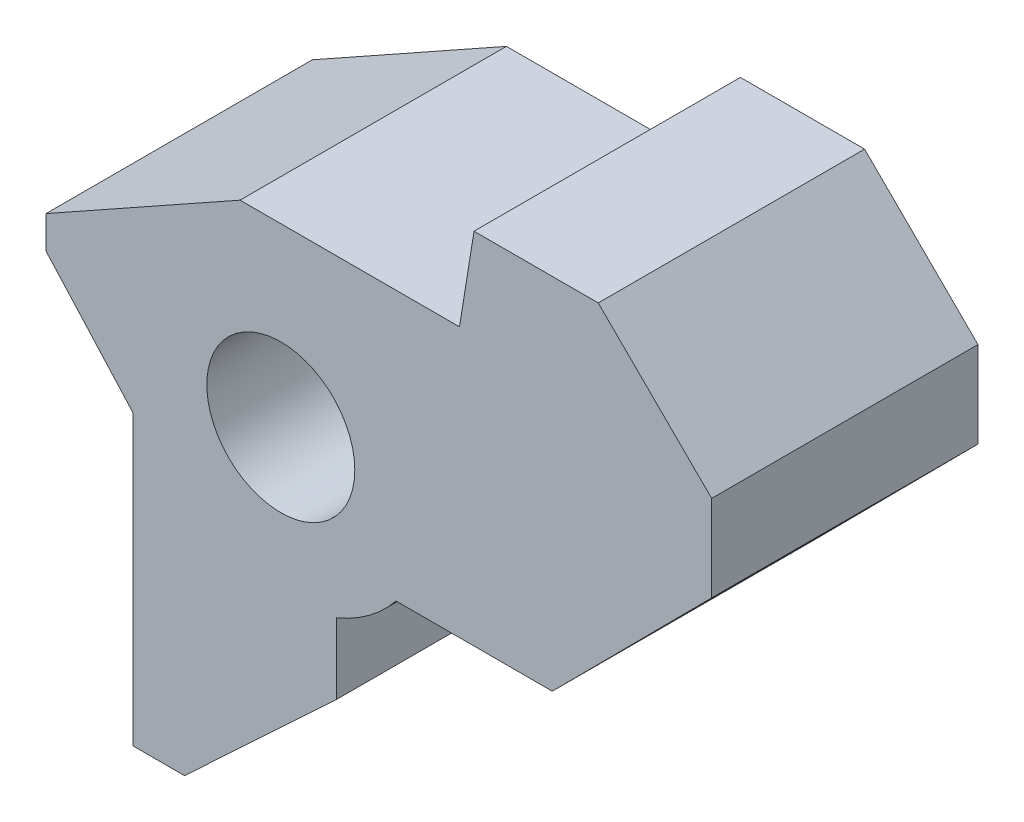
ISO-10303-21;
HEADER;
FILE_DESCRIPTION(('STEP AP214'),'2;1');
FILE_NAME('part.step','',(''),(''),'','','');
FILE_SCHEMA(('AUTOMOTIVE_DESIGN { 1 0 10303 214 1 1 1 1 }'));
ENDSEC;
DATA;
#1=APPLICATION_CONTEXT('core data for automotive mechanical design processes');
#2=APPLICATION_PROTOCOL_DEFINITION('international standard','automotive_design',2000,#1);
#3=PRODUCT_CONTEXT('',#1,'mechanical');
#4=PRODUCT('Part','Part','',(#3));
#5=PRODUCT_RELATED_PRODUCT_CATEGORY('part','',(#4));
#6=PRODUCT_DEFINITION_FORMATION('','',#4);
#7=PRODUCT_DEFINITION_CONTEXT('part definition',#1,'design');
#8=PRODUCT_DEFINITION('design','',#6,#7);
#9=PRODUCT_DEFINITION_SHAPE('','',#8);
#10=(LENGTH_UNIT() NAMED_UNIT(*) SI_UNIT(.MILLI.,.METRE.));
#11=(NAMED_UNIT(*) PLANE_ANGLE_UNIT() SI_UNIT($,.RADIAN.));
#12=(NAMED_UNIT(*) SI_UNIT($,.STERADIAN.) SOLID_ANGLE_UNIT());
#13=UNCERTAINTY_MEASURE_WITH_UNIT(LENGTH_MEASURE(1.E-05),#10,'distance_accuracy_value','');
#14=(GEOMETRIC_REPRESENTATION_CONTEXT(3) GLOBAL_UNCERTAINTY_ASSIGNED_CONTEXT((#13)) GLOBAL_UNIT_ASSIGNED_CONTEXT((#10,
#11,#12)) REPRESENTATION_CONTEXT('',''));
#15=CARTESIAN_POINT('',(0.,0.,0.));
#16=DIRECTION('',(0.,0.,1.));
#17=DIRECTION('',(1.,0.,0.));
#18=AXIS2_PLACEMENT_3D('',#15,#16,#17);
#19=CARTESIAN_POINT('',(1.87605445969652,0.,9.));
#20=DIRECTION('',(1.,0.,0.));
#21=DIRECTION('',(0.,0.,-1.));
#22=AXIS2_PLACEMENT_3D('',#19,#20,#21);
#23=PLANE('',#22);
#24=DIRECTION('',(0.,-1.,0.));
#25=VECTOR('',#24,1.);
#26=CARTESIAN_POINT('',(1.87605445969652,0.,0.));
#27=LINE('',#26,#25);
#28=CARTESIAN_POINT('',(1.87605445969652,-4.63469736490451,0.));
#29=VERTEX_POINT('',#28);
#30=CARTESIAN_POINT('',(1.87605445969652,-7.03141405348529,0.));
#31=VERTEX_POINT('',#30);
#32=EDGE_CURVE('E174',#29,#31,#27,.T.);
#33=ORIENTED_EDGE('',*,*,#32,.F.);
#34=DIRECTION('',(0.,0.,-1.));
#35=VECTOR('',#34,1.);
#36=CARTESIAN_POINT('',(1.87605445969652,-4.63469736490451,9.));
#37=LINE('',#36,#35);
#38=CARTESIAN_POINT('',(1.87605445969652,-4.63469736490451,9.));
#39=VERTEX_POINT('',#38);
#40=EDGE_CURVE('E11',#39,#29,#37,.T.);
#41=ORIENTED_EDGE('',*,*,#40,.F.);
#42=DIRECTION('',(0.,-1.,0.));
#43=VECTOR('',#42,1.);
#44=CARTESIAN_POINT('',(1.87605445969652,0.,9.));
#45=LINE('',#44,#43);
#46=CARTESIAN_POINT('',(1.87605445969652,-7.03141405348529,9.));
#47=VERTEX_POINT('',#46);
#48=EDGE_CURVE('E218',#39,#47,#45,.T.);
#49=ORIENTED_EDGE('',*,*,#48,.T.);
#50=DIRECTION('',(0.,0.,-1.));
#51=VECTOR('',#50,1.);
#52=CARTESIAN_POINT('',(1.87605445969652,-7.03141405348529,9.));
#53=LINE('',#52,#51);
#54=EDGE_CURVE('E105',#47,#31,#53,.T.);
#55=ORIENTED_EDGE('',*,*,#54,.T.);
#56=EDGE_LOOP('',(#33,#41,#49,#55));
#57=FACE_BOUND('',#56,.T.);
#58=ADVANCED_FACE('F34',(#57),#23,.T.);
#59=CARTESIAN_POINT('',(0.,0.,9.));
#60=DIRECTION('',(0.,0.,-1.));
#61=DIRECTION('',(-1.,0.,0.));
#62=AXIS2_PLACEMENT_3D('',#59,#60,#61);
#63=CYLINDRICAL_SURFACE('',#62,5.);
#64=CARTESIAN_POINT('',(0.,0.,0.));
#65=DIRECTION('',(0.,0.,1.));
#66=DIRECTION('',(1.,0.,0.));
#67=AXIS2_PLACEMENT_3D('',#64,#65,#66);
#68=CIRCLE('',#67,5.);
#69=CARTESIAN_POINT('',(3.8931956076666,-3.13736003041498,0.));
#70=VERTEX_POINT('',#69);
#71=EDGE_CURVE('E177',#29,#70,#68,.T.);
#72=ORIENTED_EDGE('',*,*,#71,.T.);
#73=DIRECTION('',(0.,0.,-1.));
#74=VECTOR('',#73,1.);
#75=CARTESIAN_POINT('',(3.8931956076666,-3.13736003041498,9.));
#76=LINE('',#75,#74);
#77=CARTESIAN_POINT('',(3.8931956076666,-3.13736003041498,9.));
#78=VERTEX_POINT('',#77);
#79=EDGE_CURVE('E42',#78,#70,#76,.T.);
#80=ORIENTED_EDGE('',*,*,#79,.F.);
#81=CARTESIAN_POINT('',(0.,0.,9.));
#82=DIRECTION('',(0.,0.,1.));
#83=DIRECTION('',(1.,0.,0.));
#84=AXIS2_PLACEMENT_3D('',#81,#82,#83);
#85=CIRCLE('',#84,5.);
#86=EDGE_CURVE('E261',#39,#78,#85,.T.);
#87=ORIENTED_EDGE('',*,*,#86,.F.);
#88=ORIENTED_EDGE('',*,*,#40,.T.);
#89=EDGE_LOOP('',(#72,#80,#87,#88));
#90=FACE_BOUND('',#89,.T.);
#91=ADVANCED_FACE('F248',(#90),#63,.T.);
#92=CARTESIAN_POINT('',(0.,-3.13736003041498,9.));
#93=DIRECTION('',(0.,-1.,0.));
#94=DIRECTION('',(1.,0.,0.));
#95=AXIS2_PLACEMENT_3D('',#92,#93,#94);
#96=PLANE('',#95);
#97=DIRECTION('',(-1.,0.,0.));
#98=VECTOR('',#97,1.);
#99=CARTESIAN_POINT('',(0.,-3.13736003041498,0.));
#100=LINE('',#99,#98);
#101=CARTESIAN_POINT('',(9.17297865889068,-3.13736003041498,0.));
#102=VERTEX_POINT('',#101);
#103=EDGE_CURVE('E180',#102,#70,#100,.T.);
#104=ORIENTED_EDGE('',*,*,#103,.F.);
#105=DIRECTION('',(0.,0.,-1.));
#106=VECTOR('',#105,1.);
#107=CARTESIAN_POINT('',(9.17297865889068,-3.13736003041498,9.));
#108=LINE('',#107,#106);
#109=CARTESIAN_POINT('',(9.17297865889068,-3.13736003041498,9.));
#110=VERTEX_POINT('',#109);
#111=EDGE_CURVE('E238',#110,#102,#108,.T.);
#112=ORIENTED_EDGE('',*,*,#111,.F.);
#113=DIRECTION('',(-1.,0.,0.));
#114=VECTOR('',#113,1.);
#115=CARTESIAN_POINT('',(0.,-3.13736003041498,9.));
#116=LINE('',#115,#114);
#117=EDGE_CURVE('E245',#110,#78,#116,.T.);
#118=ORIENTED_EDGE('',*,*,#117,.T.);
#119=ORIENTED_EDGE('',*,*,#79,.T.);
#120=EDGE_LOOP('',(#104,#112,#118,#119));
#121=FACE_BOUND('',#120,.T.);
#122=ADVANCED_FACE('F243',(#121),#96,.T.);
#123=CARTESIAN_POINT('',(6.18871742745594,-6.14355777107952,9.));
#124=DIRECTION('',(0.709691382805682,-0.704512697665102,0.));
#125=DIRECTION('',(0.704512697665102,0.709691382805682,0.));
#126=AXIS2_PLACEMENT_3D('',#123,#124,#125);
#127=PLANE('',#126);
#128=DIRECTION('',(-0.704512697665102,-0.709691382805682,0.));
#129=VECTOR('',#128,1.);
#130=CARTESIAN_POINT('',(6.18871742745594,-6.14355777107952,0.));
#131=LINE('',#130,#129);
#132=CARTESIAN_POINT('',(14.557074242056,2.28631260492328,0.));
#133=VERTEX_POINT('',#132);
#134=EDGE_CURVE('E183',#133,#102,#131,.T.);
#135=ORIENTED_EDGE('',*,*,#134,.F.);
#136=DIRECTION('',(0.,0.,-1.));
#137=VECTOR('',#136,1.);
#138=CARTESIAN_POINT('',(14.557074242056,2.28631260492328,9.));
#139=LINE('',#138,#137);
#140=CARTESIAN_POINT('',(14.557074242056,2.28631260492328,9.));
#141=VERTEX_POINT('',#140);
#142=EDGE_CURVE('E236',#141,#133,#139,.T.);
#143=ORIENTED_EDGE('',*,*,#142,.F.);
#144=DIRECTION('',(-0.704512697665102,-0.709691382805682,0.));
#145=VECTOR('',#144,1.);
#146=CARTESIAN_POINT('',(6.18871742745594,-6.14355777107952,9.));
#147=LINE('',#146,#145);
#148=EDGE_CURVE('E258',#141,#110,#147,.T.);
#149=ORIENTED_EDGE('',*,*,#148,.T.);
#150=ORIENTED_EDGE('',*,*,#111,.T.);
#151=EDGE_LOOP('',(#135,#143,#149,#150));
#152=FACE_BOUND('',#151,.T.);
#153=ADVANCED_FACE('F255',(#152),#127,.T.);
#154=CARTESIAN_POINT('',(14.557074242056,0.,9.));
#155=DIRECTION('',(1.,0.,0.));
#156=DIRECTION('',(0.,0.,-1.));
#157=AXIS2_PLACEMENT_3D('',#154,#155,#156);
#158=PLANE('',#157);
#159=DIRECTION('',(0.,-1.,0.));
#160=VECTOR('',#159,1.);
#161=CARTESIAN_POINT('',(14.557074242056,0.,0.));
#162=LINE('',#161,#160);
#163=CARTESIAN_POINT('',(14.557074242056,5.19802237614641,0.));
#164=VERTEX_POINT('',#163);
#165=EDGE_CURVE('E186',#164,#133,#162,.T.);
#166=ORIENTED_EDGE('',*,*,#165,.F.);
#167=DIRECTION('',(0.,0.,-1.));
#168=VECTOR('',#167,1.);
#169=CARTESIAN_POINT('',(14.557074242056,5.19802237614641,9.));
#170=LINE('',#169,#168);
#171=CARTESIAN_POINT('',(14.557074242056,5.19802237614641,9.));
#172=VERTEX_POINT('',#171);
#173=EDGE_CURVE('E234',#172,#164,#170,.T.);
#174=ORIENTED_EDGE('',*,*,#173,.F.);
#175=DIRECTION('',(0.,-1.,0.));
#176=VECTOR('',#175,1.);
#177=CARTESIAN_POINT('',(14.557074242056,0.,9.));
#178=LINE('',#177,#176);
#179=EDGE_CURVE('E263',#172,#141,#178,.T.);
#180=ORIENTED_EDGE('',*,*,#179,.T.);
#181=ORIENTED_EDGE('',*,*,#142,.T.);
#182=EDGE_LOOP('',(#166,#174,#180,#181));
#183=FACE_BOUND('',#182,.T.);
#184=ADVANCED_FACE('F301',(#183),#158,.T.);
#185=CARTESIAN_POINT('',(9.82417265596004,9.89638753174656,9.));
#186=DIRECTION('',(0.704512697665102,0.709691382805682,0.));
#187=DIRECTION('',(-0.709691382805682,0.704512697665102,0.));
#188=AXIS2_PLACEMENT_3D('',#185,#186,#187);
#189=PLANE('',#188);
#190=DIRECTION('',(0.709691382805682,-0.704512697665102,0.));
#191=VECTOR('',#190,1.);
#192=CARTESIAN_POINT('',(9.82417265596004,9.89638753174656,0.));
#193=LINE('',#192,#191);
#194=CARTESIAN_POINT('',(10.7256498043451,9.00148854737192,0.));
#195=VERTEX_POINT('',#194);
#196=EDGE_CURVE('E189',#195,#164,#193,.T.);
#197=ORIENTED_EDGE('',*,*,#196,.F.);
#198=DIRECTION('',(0.,0.,-1.));
#199=VECTOR('',#198,1.);
#200=CARTESIAN_POINT('',(10.7256498043451,9.00148854737192,9.));
#201=LINE('',#200,#199);
#202=CARTESIAN_POINT('',(10.7256498043451,9.00148854737192,9.));
#203=VERTEX_POINT('',#202);
#204=EDGE_CURVE('E232',#203,#195,#201,.T.);
#205=ORIENTED_EDGE('',*,*,#204,.F.);
#206=DIRECTION('',(0.709691382805682,-0.704512697665102,0.));
#207=VECTOR('',#206,1.);
#208=CARTESIAN_POINT('',(9.82417265596004,9.89638753174656,9.));
#209=LINE('',#208,#207);
#210=EDGE_CURVE('E269',#203,#172,#209,.T.);
#211=ORIENTED_EDGE('',*,*,#210,.T.);
#212=ORIENTED_EDGE('',*,*,#173,.T.);
#213=EDGE_LOOP('',(#197,#205,#211,#212));
#214=FACE_BOUND('',#213,.T.);
#215=ADVANCED_FACE('F304',(#214),#189,.T.);
#216=CARTESIAN_POINT('',(0.,9.00148854737192,9.));
#217=DIRECTION('',(0.,1.,0.));
#218=DIRECTION('',(0.,0.,1.));
#219=AXIS2_PLACEMENT_3D('',#216,#217,#218);
#220=PLANE('',#219);
#221=DIRECTION('',(1.,0.,0.));
#222=VECTOR('',#221,1.);
#223=CARTESIAN_POINT('',(0.,9.00148854737192,0.));
#224=LINE('',#223,#222);
#225=CARTESIAN_POINT('',(6.5285930170798,9.00148854737192,0.));
#226=VERTEX_POINT('',#225);
#227=EDGE_CURVE('E192',#226,#195,#224,.T.);
#228=ORIENTED_EDGE('',*,*,#227,.F.);
#229=DIRECTION('',(0.,0.,-1.));
#230=VECTOR('',#229,1.);
#231=CARTESIAN_POINT('',(6.5285930170798,9.00148854737192,9.));
#232=LINE('',#231,#230);
#233=CARTESIAN_POINT('',(6.5285930170798,9.00148854737192,9.));
#234=VERTEX_POINT('',#233);
#235=EDGE_CURVE('E230',#234,#226,#232,.T.);
#236=ORIENTED_EDGE('',*,*,#235,.F.);
#237=DIRECTION('',(1.,0.,0.));
#238=VECTOR('',#237,1.);
#239=CARTESIAN_POINT('',(0.,9.00148854737192,9.));
#240=LINE('',#239,#238);
#241=EDGE_CURVE('E272',#234,#203,#240,.T.);
#242=ORIENTED_EDGE('',*,*,#241,.T.);
#243=ORIENTED_EDGE('',*,*,#204,.T.);
#244=EDGE_LOOP('',(#228,#236,#242,#243));
#245=FACE_BOUND('',#244,.T.);
#246=ADVANCED_FACE('F308',(#245),#220,.T.);
#247=CARTESIAN_POINT('',(4.94893615583577,-0.797776271857066,9.));
#248=DIRECTION('',(-0.987254891374429,0.159147037224273,0.));
#249=DIRECTION('',(-0.159147037224273,-0.987254891374429,0.));
#250=AXIS2_PLACEMENT_3D('',#247,#248,#249);
#251=PLANE('',#250);
#252=DIRECTION('',(0.159147037224273,0.987254891374429,0.));
#253=VECTOR('',#252,1.);
#254=CARTESIAN_POINT('',(4.94893615583577,-0.797776271857066,0.));
#255=LINE('',#254,#253);
#256=CARTESIAN_POINT('',(6.03788217845628,5.95740626892641,0.));
#257=VERTEX_POINT('',#256);
#258=EDGE_CURVE('E195',#257,#226,#255,.T.);
#259=ORIENTED_EDGE('',*,*,#258,.F.);
#260=DIRECTION('',(0.,0.,-1.));
#261=VECTOR('',#260,1.);
#262=CARTESIAN_POINT('',(6.03788217845628,5.95740626892641,9.));
#263=LINE('',#262,#261);
#264=CARTESIAN_POINT('',(6.03788217845628,5.95740626892641,9.));
#265=VERTEX_POINT('',#264);
#266=EDGE_CURVE('E228',#265,#257,#263,.T.);
#267=ORIENTED_EDGE('',*,*,#266,.F.);
#268=DIRECTION('',(0.159147037224273,0.987254891374429,0.));
#269=VECTOR('',#268,1.);
#270=CARTESIAN_POINT('',(4.94893615583577,-0.797776271857066,9.));
#271=LINE('',#270,#269);
#272=EDGE_CURVE('E275',#265,#234,#271,.T.);
#273=ORIENTED_EDGE('',*,*,#272,.T.);
#274=ORIENTED_EDGE('',*,*,#235,.T.);
#275=EDGE_LOOP('',(#259,#267,#273,#274));
#276=FACE_BOUND('',#275,.T.);
#277=ADVANCED_FACE('F312',(#276),#251,.T.);
#278=CARTESIAN_POINT('',(0.,5.95740626892641,9.));
#279=DIRECTION('',(0.,-1.,0.));
#280=DIRECTION('',(1.,0.,0.));
#281=AXIS2_PLACEMENT_3D('',#278,#279,#280);
#282=PLANE('',#281);
#283=DIRECTION('',(-1.,0.,0.));
#284=VECTOR('',#283,1.);
#285=CARTESIAN_POINT('',(0.,5.95740626892641,0.));
#286=LINE('',#285,#284);
#287=CARTESIAN_POINT('',(-1.37635566788677,5.95740626892641,0.));
#288=VERTEX_POINT('',#287);
#289=EDGE_CURVE('E198',#257,#288,#286,.T.);
#290=ORIENTED_EDGE('',*,*,#289,.T.);
#291=DIRECTION('',(0.,0.,-1.));
#292=VECTOR('',#291,1.);
#293=CARTESIAN_POINT('',(-1.37635566788677,5.95740626892641,9.));
#294=LINE('',#293,#292);
#295=CARTESIAN_POINT('',(-1.37635566788677,5.95740626892641,9.));
#296=VERTEX_POINT('',#295);
#297=EDGE_CURVE('E226',#296,#288,#294,.T.);
#298=ORIENTED_EDGE('',*,*,#297,.F.);
#299=DIRECTION('',(-1.,0.,0.));
#300=VECTOR('',#299,1.);
#301=CARTESIAN_POINT('',(0.,5.95740626892641,9.));
#302=LINE('',#301,#300);
#303=EDGE_CURVE('E278',#265,#296,#302,.T.);
#304=ORIENTED_EDGE('',*,*,#303,.F.);
#305=ORIENTED_EDGE('',*,*,#266,.T.);
#306=EDGE_LOOP('',(#290,#298,#304,#305));
#307=FACE_BOUND('',#306,.T.);
#308=ADVANCED_FACE('F316',(#307),#282,.F.);
#309=CARTESIAN_POINT('',(-2.8678772487103,5.12233826098467,9.));
#310=DIRECTION('',(-0.488521388480713,0.872551919943379,0.));
#311=DIRECTION('',(-0.872551919943379,-0.488521388480713,0.));
#312=AXIS2_PLACEMENT_3D('',#309,#310,#311);
#313=PLANE('',#312);
#314=DIRECTION('',(0.872551919943379,0.488521388480713,0.));
#315=VECTOR('',#314,1.);
#316=CARTESIAN_POINT('',(-2.8678772487103,5.12233826098467,0.));
#317=LINE('',#316,#315);
#318=CARTESIAN_POINT('',(-7.93332512787259,2.28631260492328,0.));
#319=VERTEX_POINT('',#318);
#320=EDGE_CURVE('E201',#319,#288,#317,.T.);
#321=ORIENTED_EDGE('',*,*,#320,.F.);
#322=DIRECTION('',(0.,0.,-1.));
#323=VECTOR('',#322,1.);
#324=CARTESIAN_POINT('',(-7.93332512787259,2.28631260492328,9.));
#325=LINE('',#324,#323);
#326=CARTESIAN_POINT('',(-7.93332512787259,2.28631260492328,9.));
#327=VERTEX_POINT('',#326);
#328=EDGE_CURVE('E224',#327,#319,#325,.T.);
#329=ORIENTED_EDGE('',*,*,#328,.F.);
#330=DIRECTION('',(0.872551919943379,0.488521388480713,0.));
#331=VECTOR('',#330,1.);
#332=CARTESIAN_POINT('',(-2.8678772487103,5.12233826098467,9.));
#333=LINE('',#332,#331);
#334=EDGE_CURVE('E280',#327,#296,#333,.T.);
#335=ORIENTED_EDGE('',*,*,#334,.T.);
#336=ORIENTED_EDGE('',*,*,#297,.T.);
#337=EDGE_LOOP('',(#321,#329,#335,#336));
#338=FACE_BOUND('',#337,.T.);
#339=ADVANCED_FACE('F320',(#338),#313,.T.);
#340=CARTESIAN_POINT('',(-7.93332512787259,0.,9.));
#341=DIRECTION('',(-1.,0.,0.));
#342=DIRECTION('',(0.,0.,1.));
#343=AXIS2_PLACEMENT_3D('',#340,#341,#342);
#344=PLANE('',#343);
#345=DIRECTION('',(0.,1.,0.));
#346=VECTOR('',#345,1.);
#347=CARTESIAN_POINT('',(-7.93332512787259,0.,0.));
#348=LINE('',#347,#346);
#349=CARTESIAN_POINT('',(-7.93332512787259,1.18824290486244,0.));
#350=VERTEX_POINT('',#349);
#351=EDGE_CURVE('E204',#350,#319,#348,.T.);
#352=ORIENTED_EDGE('',*,*,#351,.F.);
#353=DIRECTION('',(0.,0.,-1.));
#354=VECTOR('',#353,1.);
#355=CARTESIAN_POINT('',(-7.93332512787259,1.18824290486244,9.));
#356=LINE('',#355,#354);
#357=CARTESIAN_POINT('',(-7.93332512787259,1.18824290486244,9.));
#358=VERTEX_POINT('',#357);
#359=EDGE_CURVE('E222',#358,#350,#356,.T.);
#360=ORIENTED_EDGE('',*,*,#359,.F.);
#361=DIRECTION('',(0.,1.,0.));
#362=VECTOR('',#361,1.);
#363=CARTESIAN_POINT('',(-7.93332512787259,0.,9.));
#364=LINE('',#363,#362);
#365=EDGE_CURVE('E283',#358,#327,#364,.T.);
#366=ORIENTED_EDGE('',*,*,#365,.T.);
#367=ORIENTED_EDGE('',*,*,#328,.T.);
#368=EDGE_LOOP('',(#352,#360,#366,#367));
#369=FACE_BOUND('',#368,.T.);
#370=ADVANCED_FACE('F324',(#369),#344,.T.);
#371=CARTESIAN_POINT('',(-3.78659119415008,-3.41274346894509,9.));
#372=DIRECTION('',(-0.742824639331619,-0.66948603809329,0.));
#373=DIRECTION('',(0.66948603809329,-0.742824639331619,0.));
#374=AXIS2_PLACEMENT_3D('',#371,#372,#373);
#375=PLANE('',#374);
#376=DIRECTION('',(-0.66948603809329,0.742824639331619,0.));
#377=VECTOR('',#376,1.);
#378=CARTESIAN_POINT('',(-3.78659119415008,-3.41274346894509,0.));
#379=LINE('',#378,#377);
#380=CARTESIAN_POINT('',(-5.,-2.06641224277891,0.));
#381=VERTEX_POINT('',#380);
#382=EDGE_CURVE('E207',#381,#350,#379,.T.);
#383=ORIENTED_EDGE('',*,*,#382,.F.);
#384=DIRECTION('',(0.,0.,-1.));
#385=VECTOR('',#384,1.);
#386=CARTESIAN_POINT('',(-5.,-2.06641224277891,9.));
#387=LINE('',#386,#385);
#388=CARTESIAN_POINT('',(-5.,-2.06641224277891,9.));
#389=VERTEX_POINT('',#388);
#390=EDGE_CURVE('E156',#389,#381,#387,.T.);
#391=ORIENTED_EDGE('',*,*,#390,.F.);
#392=DIRECTION('',(-0.66948603809329,0.742824639331619,0.));
#393=VECTOR('',#392,1.);
#394=CARTESIAN_POINT('',(-3.78659119415008,-3.41274346894509,9.));
#395=LINE('',#394,#393);
#396=EDGE_CURVE('E164',#389,#358,#395,.T.);
#397=ORIENTED_EDGE('',*,*,#396,.T.);
#398=ORIENTED_EDGE('',*,*,#359,.T.);
#399=EDGE_LOOP('',(#383,#391,#397,#398));
#400=FACE_BOUND('',#399,.T.);
#401=ADVANCED_FACE('F287',(#400),#375,.T.);
#402=CARTESIAN_POINT('',(-5.,0.,9.));
#403=DIRECTION('',(-1.,0.,0.));
#404=DIRECTION('',(0.,0.,1.));
#405=AXIS2_PLACEMENT_3D('',#402,#403,#404);
#406=PLANE('',#405);
#407=DIRECTION('',(0.,1.,0.));
#408=VECTOR('',#407,1.);
#409=CARTESIAN_POINT('',(-5.,0.,0.));
#410=LINE('',#409,#408);
#411=CARTESIAN_POINT('',(-5.,-11.8208712627164,0.));
#412=VERTEX_POINT('',#411);
#413=EDGE_CURVE('E151',#412,#381,#410,.T.);
#414=ORIENTED_EDGE('',*,*,#413,.F.);
#415=DIRECTION('',(0.,0.,-1.));
#416=VECTOR('',#415,1.);
#417=CARTESIAN_POINT('',(-5.,-11.8208712627164,9.));
#418=LINE('',#417,#416);
#419=CARTESIAN_POINT('',(-5.,-11.8208712627164,9.));
#420=VERTEX_POINT('',#419);
#421=EDGE_CURVE('E146',#420,#412,#418,.T.);
#422=ORIENTED_EDGE('',*,*,#421,.F.);
#423=DIRECTION('',(0.,1.,0.));
#424=VECTOR('',#423,1.);
#425=CARTESIAN_POINT('',(-5.,0.,9.));
#426=LINE('',#425,#424);
#427=EDGE_CURVE('E149',#420,#389,#426,.T.);
#428=ORIENTED_EDGE('',*,*,#427,.T.);
#429=ORIENTED_EDGE('',*,*,#390,.T.);
#430=EDGE_LOOP('',(#414,#422,#428,#429));
#431=FACE_BOUND('',#430,.T.);
#432=ADVANCED_FACE('F148',(#431),#406,.T.);
#433=CARTESIAN_POINT('',(0.,-11.8208712627164,9.));
#434=DIRECTION('',(0.,-1.,0.));
#435=DIRECTION('',(0.,0.,-1.));
#436=AXIS2_PLACEMENT_3D('',#433,#434,#435);
#437=PLANE('',#436);
#438=DIRECTION('',(-1.,0.,0.));
#439=VECTOR('',#438,1.);
#440=CARTESIAN_POINT('',(0.,-11.8208712627164,0.));
#441=LINE('',#440,#439);
#442=CARTESIAN_POINT('',(-3.25347983881159,-11.8208712627164,0.));
#443=VERTEX_POINT('',#442);
#444=EDGE_CURVE('E211',#443,#412,#441,.T.);
#445=ORIENTED_EDGE('',*,*,#444,.F.);
#446=DIRECTION('',(0.,0.,-1.));
#447=VECTOR('',#446,1.);
#448=CARTESIAN_POINT('',(-3.25347983881159,-11.8208712627164,9.));
#449=LINE('',#448,#447);
#450=CARTESIAN_POINT('',(-3.25347983881159,-11.8208712627164,9.));
#451=VERTEX_POINT('',#450);
#452=EDGE_CURVE('E98',#451,#443,#449,.T.);
#453=ORIENTED_EDGE('',*,*,#452,.F.);
#454=DIRECTION('',(-1.,0.,0.));
#455=VECTOR('',#454,1.);
#456=CARTESIAN_POINT('',(0.,-11.8208712627164,9.));
#457=LINE('',#456,#455);
#458=EDGE_CURVE('E161',#451,#420,#457,.T.);
#459=ORIENTED_EDGE('',*,*,#458,.T.);
#460=ORIENTED_EDGE('',*,*,#421,.T.);
#461=EDGE_LOOP('',(#445,#453,#459,#460));
#462=FACE_BOUND('',#461,.T.);
#463=ADVANCED_FACE('F166',(#462),#437,.T.);
#464=CARTESIAN_POINT('',(4.38123273818553,-4.69232370569134,9.));
#465=DIRECTION('',(-0.682462310143159,0.730920785881796,0.));
#466=DIRECTION('',(-0.730920785881796,-0.682462310143159,0.));
#467=AXIS2_PLACEMENT_3D('',#464,#465,#466);
#468=PLANE('',#467);
#469=DIRECTION('',(0.730920785881796,0.682462310143159,0.));
#470=VECTOR('',#469,1.);
#471=CARTESIAN_POINT('',(4.38123273818553,-4.69232370569134,0.));
#472=LINE('',#471,#470);
#473=EDGE_CURVE('E213',#443,#31,#472,.T.);
#474=ORIENTED_EDGE('',*,*,#473,.T.);
#475=ORIENTED_EDGE('',*,*,#54,.F.);
#476=DIRECTION('',(0.730920785881796,0.682462310143159,0.));
#477=VECTOR('',#476,1.);
#478=CARTESIAN_POINT('',(4.38123273818553,-4.69232370569134,9.));
#479=LINE('',#478,#477);
#480=EDGE_CURVE('E50',#451,#47,#479,.T.);
#481=ORIENTED_EDGE('',*,*,#480,.F.);
#482=ORIENTED_EDGE('',*,*,#452,.T.);
#483=EDGE_LOOP('',(#474,#475,#481,#482));
#484=FACE_BOUND('',#483,.T.);
#485=ADVANCED_FACE('F289',(#484),#468,.F.);
#486=CARTESIAN_POINT('',(0.,0.,9.));
#487=DIRECTION('',(0.,0.,-1.));
#488=DIRECTION('',(-1.,0.,0.));
#489=AXIS2_PLACEMENT_3D('',#486,#487,#488);
#490=CYLINDRICAL_SURFACE('',#489,2.5);
#491=CARTESIAN_POINT('',(0.,0.,9.));
#492=DIRECTION('',(0.,0.,1.));
#493=DIRECTION('',(1.,0.,0.));
#494=AXIS2_PLACEMENT_3D('',#491,#492,#493);
#495=CIRCLE('',#494,2.5);
#496=CARTESIAN_POINT('',(2.5,0.,9.));
#497=VERTEX_POINT('',#496);
#498=EDGE_CURVE('E168',#497,#497,#495,.T.);
#499=ORIENTED_EDGE('',*,*,#498,.T.);
#500=EDGE_LOOP('',(#499));
#501=FACE_BOUND('',#500,.T.);
#502=CARTESIAN_POINT('',(0.,0.,0.));
#503=DIRECTION('',(0.,0.,1.));
#504=DIRECTION('',(1.,0.,0.));
#505=AXIS2_PLACEMENT_3D('',#502,#503,#504);
#506=CIRCLE('',#505,2.5);
#507=CARTESIAN_POINT('',(2.5,0.,0.));
#508=VERTEX_POINT('',#507);
#509=EDGE_CURVE('E215',#508,#508,#506,.T.);
#510=ORIENTED_EDGE('',*,*,#509,.F.);
#511=EDGE_LOOP('',(#510));
#512=FACE_BOUND('',#511,.T.);
#513=ADVANCED_FACE('F337',(#501,#512),#490,.F.);
#514=CARTESIAN_POINT('',(0.,0.,9.));
#515=DIRECTION('',(0.,0.,1.));
#516=DIRECTION('',(1.,0.,0.));
#517=AXIS2_PLACEMENT_3D('',#514,#515,#516);
#518=PLANE('',#517);
#519=ORIENTED_EDGE('',*,*,#48,.F.);
#520=ORIENTED_EDGE('',*,*,#86,.T.);
#521=ORIENTED_EDGE('',*,*,#117,.F.);
#522=ORIENTED_EDGE('',*,*,#148,.F.);
#523=ORIENTED_EDGE('',*,*,#179,.F.);
#524=ORIENTED_EDGE('',*,*,#210,.F.);
#525=ORIENTED_EDGE('',*,*,#241,.F.);
#526=ORIENTED_EDGE('',*,*,#272,.F.);
#527=ORIENTED_EDGE('',*,*,#303,.T.);
#528=ORIENTED_EDGE('',*,*,#334,.F.);
#529=ORIENTED_EDGE('',*,*,#365,.F.);
#530=ORIENTED_EDGE('',*,*,#396,.F.);
#531=ORIENTED_EDGE('',*,*,#427,.F.);
#532=ORIENTED_EDGE('',*,*,#458,.F.);
#533=ORIENTED_EDGE('',*,*,#480,.T.);
#534=EDGE_LOOP('',(#519,#520,#521,#522,#523,#524,#525,#526,#527,#528,#529,#530,#531,#532,#533));
#535=FACE_BOUND('',#534,.T.);
#536=ORIENTED_EDGE('',*,*,#498,.F.);
#537=EDGE_LOOP('',(#536));
#538=FACE_BOUND('',#537,.T.);
#539=ADVANCED_FACE('F159',(#535,#538),#518,.T.);
#540=CARTESIAN_POINT('',(0.,0.,0.));
#541=DIRECTION('',(0.,0.,1.));
#542=DIRECTION('',(1.,0.,0.));
#543=AXIS2_PLACEMENT_3D('',#540,#541,#542);
#544=PLANE('',#543);
#545=ORIENTED_EDGE('',*,*,#32,.T.);
#546=ORIENTED_EDGE('',*,*,#473,.F.);
#547=ORIENTED_EDGE('',*,*,#444,.T.);
#548=ORIENTED_EDGE('',*,*,#413,.T.);
#549=ORIENTED_EDGE('',*,*,#382,.T.);
#550=ORIENTED_EDGE('',*,*,#351,.T.);
#551=ORIENTED_EDGE('',*,*,#320,.T.);
#552=ORIENTED_EDGE('',*,*,#289,.F.);
#553=ORIENTED_EDGE('',*,*,#258,.T.);
#554=ORIENTED_EDGE('',*,*,#227,.T.);
#555=ORIENTED_EDGE('',*,*,#196,.T.);
#556=ORIENTED_EDGE('',*,*,#165,.T.);
#557=ORIENTED_EDGE('',*,*,#134,.T.);
#558=ORIENTED_EDGE('',*,*,#103,.T.);
#559=ORIENTED_EDGE('',*,*,#71,.F.);
#560=EDGE_LOOP('',(#545,#546,#547,#548,#549,#550,#551,#552,#553,#554,#555,#556,#557,#558,#559));
#561=FACE_BOUND('',#560,.T.);
#562=ORIENTED_EDGE('',*,*,#509,.T.);
#563=EDGE_LOOP('',(#562));
#564=FACE_BOUND('',#563,.T.);
#565=ADVANCED_FACE('F250',(#561,#564),#544,.F.);
#566=CLOSED_SHELL('',(#58,#91,#122,#153,#184,#215,#246,#277,#308,#339,#370,#401,#432,#463,#485,
#513,#539,#565));
#567=MANIFOLD_SOLID_BREP('B2',#566);
#568=ADVANCED_BREP_SHAPE_REPRESENTATION('',(#18,#567),#14);
#569=SHAPE_DEFINITION_REPRESENTATION(#9,#568);
ENDSEC;
END-ISO-10303-21;
